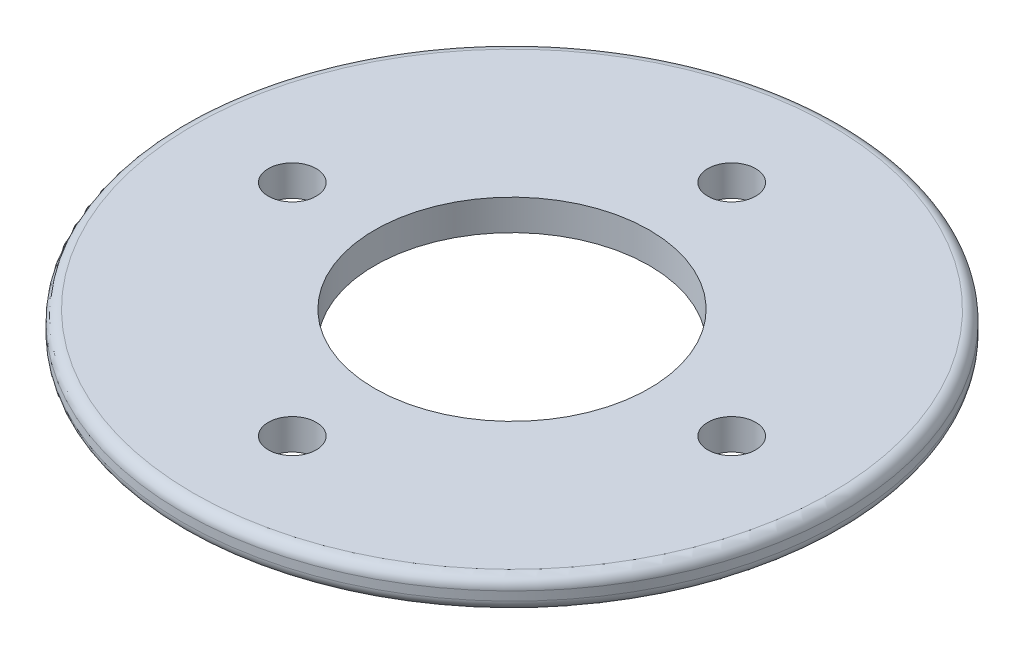
ISO-10303-21;
HEADER;
FILE_DESCRIPTION(('STEP AP214'),'2;1');
FILE_NAME('part.step','',(''),(''),'','','');
FILE_SCHEMA(('AUTOMOTIVE_DESIGN { 1 0 10303 214 1 1 1 1 }'));
ENDSEC;
DATA;
#1=APPLICATION_CONTEXT('core data for automotive mechanical design processes');
#2=APPLICATION_PROTOCOL_DEFINITION('international standard','automotive_design',2000,#1);
#3=PRODUCT_CONTEXT('',#1,'mechanical');
#4=PRODUCT('Part','Part','',(#3));
#5=PRODUCT_RELATED_PRODUCT_CATEGORY('part','',(#4));
#6=PRODUCT_DEFINITION_FORMATION('','',#4);
#7=PRODUCT_DEFINITION_CONTEXT('part definition',#1,'design');
#8=PRODUCT_DEFINITION('design','',#6,#7);
#9=PRODUCT_DEFINITION_SHAPE('','',#8);
#10=(LENGTH_UNIT() NAMED_UNIT(*) SI_UNIT(.MILLI.,.METRE.));
#11=(NAMED_UNIT(*) PLANE_ANGLE_UNIT() SI_UNIT($,.RADIAN.));
#12=(NAMED_UNIT(*) SI_UNIT($,.STERADIAN.) SOLID_ANGLE_UNIT());
#13=UNCERTAINTY_MEASURE_WITH_UNIT(LENGTH_MEASURE(1.E-05),#10,'distance_accuracy_value','');
#14=(GEOMETRIC_REPRESENTATION_CONTEXT(3) GLOBAL_UNCERTAINTY_ASSIGNED_CONTEXT((#13)) GLOBAL_UNIT_ASSIGNED_CONTEXT((#10,
#11,#12)) REPRESENTATION_CONTEXT('',''));
#15=CARTESIAN_POINT('',(0.,0.,0.));
#16=DIRECTION('',(0.,0.,1.));
#17=DIRECTION('',(1.,0.,0.));
#18=AXIS2_PLACEMENT_3D('',#15,#16,#17);
#19=CARTESIAN_POINT('',(0.,1.4,0.));
#20=DIRECTION('',(0.,-1.,0.));
#21=DIRECTION('',(0.,0.,-1.));
#22=AXIS2_PLACEMENT_3D('',#19,#20,#21);
#23=CYLINDRICAL_SURFACE('',#22,15.);
#24=CARTESIAN_POINT('',(0.,0.5,0.));
#25=DIRECTION('',(0.,1.,0.));
#26=DIRECTION('',(0.,0.,1.));
#27=AXIS2_PLACEMENT_3D('',#24,#25,#26);
#28=CIRCLE('',#27,15.);
#29=CARTESIAN_POINT('',(0.,0.5,15.));
#30=VERTEX_POINT('',#29);
#31=EDGE_CURVE('E44',#30,#30,#28,.T.);
#32=ORIENTED_EDGE('',*,*,#31,.T.);
#33=EDGE_LOOP('',(#32));
#34=FACE_BOUND('',#33,.T.);
#35=CARTESIAN_POINT('',(0.,0.9,0.));
#36=DIRECTION('',(0.,1.,0.));
#37=DIRECTION('',(0.,0.,1.));
#38=AXIS2_PLACEMENT_3D('',#35,#36,#37);
#39=CIRCLE('',#38,15.);
#40=CARTESIAN_POINT('',(0.,0.9,15.));
#41=VERTEX_POINT('',#40);
#42=EDGE_CURVE('E49',#41,#41,#39,.F.);
#43=ORIENTED_EDGE('',*,*,#42,.T.);
#44=EDGE_LOOP('',(#43));
#45=FACE_BOUND('',#44,.T.);
#46=ADVANCED_FACE('F32',(#34,#45),#23,.T.);
#47=CARTESIAN_POINT('',(0.,1.4,0.));
#48=DIRECTION('',(0.,1.,0.));
#49=DIRECTION('',(0.,0.,1.));
#50=AXIS2_PLACEMENT_3D('',#47,#48,#49);
#51=PLANE('',#50);
#52=CARTESIAN_POINT('',(0.,1.4,0.));
#53=DIRECTION('',(0.,1.,0.));
#54=DIRECTION('',(0.,0.,1.));
#55=AXIS2_PLACEMENT_3D('',#52,#53,#54);
#56=CIRCLE('',#55,6.25);
#57=CARTESIAN_POINT('',(0.,1.4,6.25));
#58=VERTEX_POINT('',#57);
#59=EDGE_CURVE('E76',#58,#58,#56,.T.);
#60=ORIENTED_EDGE('',*,*,#59,.F.);
#61=EDGE_LOOP('',(#60));
#62=FACE_BOUND('',#61,.T.);
#63=CARTESIAN_POINT('',(0.,1.4,0.));
#64=DIRECTION('',(0.,1.,0.));
#65=DIRECTION('',(0.,0.,1.));
#66=AXIS2_PLACEMENT_3D('',#63,#64,#65);
#67=CIRCLE('',#66,14.5);
#68=CARTESIAN_POINT('',(0.,1.4,14.5));
#69=VERTEX_POINT('',#68);
#70=EDGE_CURVE('E10',#69,#69,#67,.T.);
#71=ORIENTED_EDGE('',*,*,#70,.T.);
#72=EDGE_LOOP('',(#71));
#73=FACE_BOUND('',#72,.T.);
#74=CARTESIAN_POINT('',(10.,1.4,-1.04744440165294E-13));
#75=DIRECTION('',(0.,1.,0.));
#76=DIRECTION('',(-1.,0.,0.));
#77=AXIS2_PLACEMENT_3D('',#74,#75,#76);
#78=CIRCLE('',#77,1.09);
#79=CARTESIAN_POINT('',(8.91,1.4,0.));
#80=VERTEX_POINT('',#79);
#81=EDGE_CURVE('E70',#80,#80,#78,.T.);
#82=ORIENTED_EDGE('',*,*,#81,.F.);
#83=EDGE_LOOP('',(#82));
#84=FACE_BOUND('',#83,.T.);
#85=CARTESIAN_POINT('',(0.,1.4,10.));
#86=DIRECTION('',(0.,1.,0.));
#87=DIRECTION('',(0.,0.,-1.));
#88=AXIS2_PLACEMENT_3D('',#85,#86,#87);
#89=CIRCLE('',#88,1.09);
#90=CARTESIAN_POINT('',(0.,1.4,8.91));
#91=VERTEX_POINT('',#90);
#92=EDGE_CURVE('E64',#91,#91,#89,.T.);
#93=ORIENTED_EDGE('',*,*,#92,.F.);
#94=EDGE_LOOP('',(#93));
#95=FACE_BOUND('',#94,.T.);
#96=CARTESIAN_POINT('',(-10.,1.4,0.));
#97=DIRECTION('',(0.,1.,0.));
#98=DIRECTION('',(1.,0.,0.));
#99=AXIS2_PLACEMENT_3D('',#96,#97,#98);
#100=CIRCLE('',#99,1.09);
#101=CARTESIAN_POINT('',(-8.91,1.4,0.));
#102=VERTEX_POINT('',#101);
#103=EDGE_CURVE('E58',#102,#102,#100,.T.);
#104=ORIENTED_EDGE('',*,*,#103,.F.);
#105=EDGE_LOOP('',(#104));
#106=FACE_BOUND('',#105,.T.);
#107=CARTESIAN_POINT('',(0.,1.4,-10.));
#108=DIRECTION('',(0.,1.,0.));
#109=DIRECTION('',(0.,0.,1.));
#110=AXIS2_PLACEMENT_3D('',#107,#108,#109);
#111=CIRCLE('',#110,1.09);
#112=CARTESIAN_POINT('',(0.,1.4,-8.91));
#113=VERTEX_POINT('',#112);
#114=EDGE_CURVE('E55',#113,#113,#111,.T.);
#115=ORIENTED_EDGE('',*,*,#114,.F.);
#116=EDGE_LOOP('',(#115));
#117=FACE_BOUND('',#116,.T.);
#118=ADVANCED_FACE('F96',(#62,#73,#84,#95,#106,#117),#51,.T.);
#119=CARTESIAN_POINT('',(0.,0.,0.));
#120=DIRECTION('',(0.,1.,0.));
#121=DIRECTION('',(0.,0.,1.));
#122=AXIS2_PLACEMENT_3D('',#119,#120,#121);
#123=PLANE('',#122);
#124=CARTESIAN_POINT('',(0.,0.,0.));
#125=DIRECTION('',(0.,1.,0.));
#126=DIRECTION('',(0.,0.,1.));
#127=AXIS2_PLACEMENT_3D('',#124,#125,#126);
#128=CIRCLE('',#127,6.25);
#129=CARTESIAN_POINT('',(0.,0.,6.25));
#130=VERTEX_POINT('',#129);
#131=EDGE_CURVE('E36',#130,#130,#128,.T.);
#132=ORIENTED_EDGE('',*,*,#131,.T.);
#133=EDGE_LOOP('',(#132));
#134=FACE_BOUND('',#133,.T.);
#135=CARTESIAN_POINT('',(0.,0.,0.));
#136=DIRECTION('',(0.,1.,0.));
#137=DIRECTION('',(0.,0.,1.));
#138=AXIS2_PLACEMENT_3D('',#135,#136,#137);
#139=CIRCLE('',#138,14.5);
#140=CARTESIAN_POINT('',(0.,0.,14.5));
#141=VERTEX_POINT('',#140);
#142=EDGE_CURVE('E40',#141,#141,#139,.F.);
#143=ORIENTED_EDGE('',*,*,#142,.T.);
#144=EDGE_LOOP('',(#143));
#145=FACE_BOUND('',#144,.T.);
#146=CARTESIAN_POINT('',(10.,0.,-1.04744440165294E-13));
#147=DIRECTION('',(0.,1.,0.));
#148=DIRECTION('',(-1.,0.,0.));
#149=AXIS2_PLACEMENT_3D('',#146,#147,#148);
#150=CIRCLE('',#149,1.09);
#151=CARTESIAN_POINT('',(8.91,0.,0.));
#152=VERTEX_POINT('',#151);
#153=EDGE_CURVE('E73',#152,#152,#150,.F.);
#154=ORIENTED_EDGE('',*,*,#153,.F.);
#155=EDGE_LOOP('',(#154));
#156=FACE_BOUND('',#155,.T.);
#157=CARTESIAN_POINT('',(0.,0.,10.));
#158=DIRECTION('',(0.,1.,0.));
#159=DIRECTION('',(0.,0.,-1.));
#160=AXIS2_PLACEMENT_3D('',#157,#158,#159);
#161=CIRCLE('',#160,1.09);
#162=CARTESIAN_POINT('',(0.,0.,8.91));
#163=VERTEX_POINT('',#162);
#164=EDGE_CURVE('E67',#163,#163,#161,.F.);
#165=ORIENTED_EDGE('',*,*,#164,.F.);
#166=EDGE_LOOP('',(#165));
#167=FACE_BOUND('',#166,.T.);
#168=CARTESIAN_POINT('',(-10.,0.,0.));
#169=DIRECTION('',(0.,1.,0.));
#170=DIRECTION('',(1.,0.,0.));
#171=AXIS2_PLACEMENT_3D('',#168,#169,#170);
#172=CIRCLE('',#171,1.09);
#173=CARTESIAN_POINT('',(-8.91,0.,0.));
#174=VERTEX_POINT('',#173);
#175=EDGE_CURVE('E61',#174,#174,#172,.F.);
#176=ORIENTED_EDGE('',*,*,#175,.F.);
#177=EDGE_LOOP('',(#176));
#178=FACE_BOUND('',#177,.T.);
#179=CARTESIAN_POINT('',(0.,0.,-10.));
#180=DIRECTION('',(0.,1.,0.));
#181=DIRECTION('',(0.,0.,1.));
#182=AXIS2_PLACEMENT_3D('',#179,#180,#181);
#183=CIRCLE('',#182,1.09);
#184=CARTESIAN_POINT('',(0.,0.,-8.91));
#185=VERTEX_POINT('',#184);
#186=EDGE_CURVE('E52',#185,#185,#183,.F.);
#187=ORIENTED_EDGE('',*,*,#186,.F.);
#188=EDGE_LOOP('',(#187));
#189=FACE_BOUND('',#188,.T.);
#190=ADVANCED_FACE('F83',(#134,#145,#156,#167,#178,#189),#123,.F.);
#191=CARTESIAN_POINT('',(0.,-3.08298556597335,-10.));
#192=DIRECTION('',(0.,1.,0.));
#193=DIRECTION('',(0.,0.,1.));
#194=AXIS2_PLACEMENT_3D('',#191,#192,#193);
#195=CYLINDRICAL_SURFACE('',#194,1.09);
#196=ORIENTED_EDGE('',*,*,#186,.T.);
#197=EDGE_LOOP('',(#196));
#198=FACE_BOUND('',#197,.T.);
#199=ORIENTED_EDGE('',*,*,#114,.T.);
#200=EDGE_LOOP('',(#199));
#201=FACE_BOUND('',#200,.T.);
#202=ADVANCED_FACE('F119',(#198,#201),#195,.F.);
#203=CARTESIAN_POINT('',(-10.,-3.08298556597335,0.));
#204=DIRECTION('',(0.,1.,0.));
#205=DIRECTION('',(1.,0.,0.));
#206=AXIS2_PLACEMENT_3D('',#203,#204,#205);
#207=CYLINDRICAL_SURFACE('',#206,1.09);
#208=ORIENTED_EDGE('',*,*,#175,.T.);
#209=EDGE_LOOP('',(#208));
#210=FACE_BOUND('',#209,.T.);
#211=ORIENTED_EDGE('',*,*,#103,.T.);
#212=EDGE_LOOP('',(#211));
#213=FACE_BOUND('',#212,.T.);
#214=ADVANCED_FACE('F130',(#210,#213),#207,.F.);
#215=CARTESIAN_POINT('',(0.,-3.08298556597335,10.));
#216=DIRECTION('',(0.,1.,0.));
#217=DIRECTION('',(0.,0.,-1.));
#218=AXIS2_PLACEMENT_3D('',#215,#216,#217);
#219=CYLINDRICAL_SURFACE('',#218,1.09);
#220=ORIENTED_EDGE('',*,*,#164,.T.);
#221=EDGE_LOOP('',(#220));
#222=FACE_BOUND('',#221,.T.);
#223=ORIENTED_EDGE('',*,*,#92,.T.);
#224=EDGE_LOOP('',(#223));
#225=FACE_BOUND('',#224,.T.);
#226=ADVANCED_FACE('F112',(#222,#225),#219,.F.);
#227=CARTESIAN_POINT('',(10.,-3.08298556597335,-1.04744440165294E-13));
#228=DIRECTION('',(0.,1.,0.));
#229=DIRECTION('',(-1.,0.,0.));
#230=AXIS2_PLACEMENT_3D('',#227,#228,#229);
#231=CYLINDRICAL_SURFACE('',#230,1.09);
#232=ORIENTED_EDGE('',*,*,#153,.T.);
#233=EDGE_LOOP('',(#232));
#234=FACE_BOUND('',#233,.T.);
#235=ORIENTED_EDGE('',*,*,#81,.T.);
#236=EDGE_LOOP('',(#235));
#237=FACE_BOUND('',#236,.T.);
#238=ADVANCED_FACE('F107',(#234,#237),#231,.F.);
#239=CARTESIAN_POINT('',(0.,0.5,0.));
#240=DIRECTION('',(0.,1.,0.));
#241=DIRECTION('',(0.,0.,1.));
#242=AXIS2_PLACEMENT_3D('',#239,#240,#241);
#243=TOROIDAL_SURFACE('',#242,14.5,0.5);
#244=ORIENTED_EDGE('',*,*,#142,.F.);
#245=EDGE_LOOP('',(#244));
#246=FACE_BOUND('',#245,.T.);
#247=ORIENTED_EDGE('',*,*,#31,.F.);
#248=EDGE_LOOP('',(#247));
#249=FACE_BOUND('',#248,.T.);
#250=ADVANCED_FACE('F92',(#246,#249),#243,.T.);
#251=CARTESIAN_POINT('',(0.,0.9,0.));
#252=DIRECTION('',(0.,1.,0.));
#253=DIRECTION('',(0.,0.,1.));
#254=AXIS2_PLACEMENT_3D('',#251,#252,#253);
#255=TOROIDAL_SURFACE('',#254,14.5,0.5);
#256=ORIENTED_EDGE('',*,*,#42,.F.);
#257=EDGE_LOOP('',(#256));
#258=FACE_BOUND('',#257,.T.);
#259=ORIENTED_EDGE('',*,*,#70,.F.);
#260=EDGE_LOOP('',(#259));
#261=FACE_BOUND('',#260,.T.);
#262=ADVANCED_FACE('F34',(#258,#261),#255,.T.);
#263=CARTESIAN_POINT('',(0.,-23.6,0.));
#264=DIRECTION('',(0.,1.,0.));
#265=DIRECTION('',(0.,0.,1.));
#266=AXIS2_PLACEMENT_3D('',#263,#264,#265);
#267=CYLINDRICAL_SURFACE('',#266,6.25);
#268=ORIENTED_EDGE('',*,*,#59,.T.);
#269=EDGE_LOOP('',(#268));
#270=FACE_BOUND('',#269,.T.);
#271=ORIENTED_EDGE('',*,*,#131,.F.);
#272=EDGE_LOOP('',(#271));
#273=FACE_BOUND('',#272,.T.);
#274=ADVANCED_FACE('F86',(#270,#273),#267,.F.);
#275=CLOSED_SHELL('',(#46,#118,#190,#202,#214,#226,#238,#250,#262,#274));
#276=MANIFOLD_SOLID_BREP('B2',#275);
#277=ADVANCED_BREP_SHAPE_REPRESENTATION('',(#18,#276),#14);
#278=SHAPE_DEFINITION_REPRESENTATION(#9,#277);
ENDSEC;
END-ISO-10303-21;
